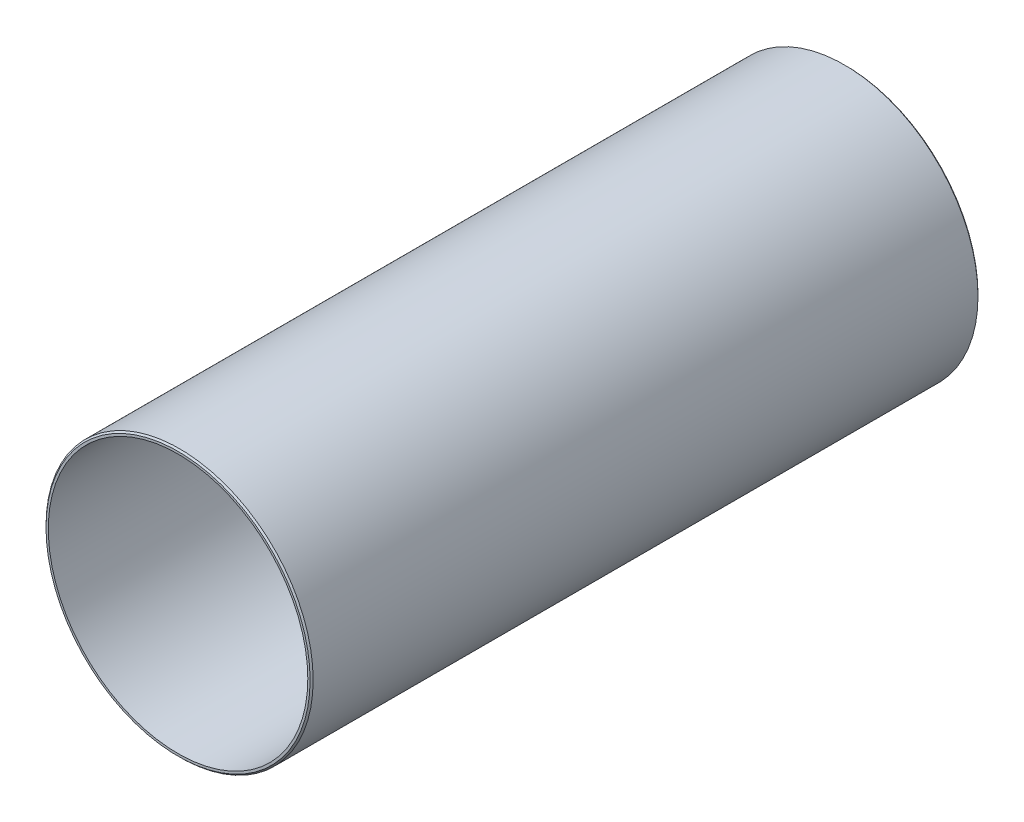
ISO-10303-21;
HEADER;
FILE_DESCRIPTION(('STEP AP214'),'2;1');
FILE_NAME('part.step','',(''),(''),'','','');
FILE_SCHEMA(('AUTOMOTIVE_DESIGN { 1 0 10303 214 1 1 1 1 }'));
ENDSEC;
DATA;
#1=APPLICATION_CONTEXT('core data for automotive mechanical design processes');
#2=APPLICATION_PROTOCOL_DEFINITION('international standard','automotive_design',2000,#1);
#3=PRODUCT_CONTEXT('',#1,'mechanical');
#4=PRODUCT('Part','Part','',(#3));
#5=PRODUCT_RELATED_PRODUCT_CATEGORY('part','',(#4));
#6=PRODUCT_DEFINITION_FORMATION('','',#4);
#7=PRODUCT_DEFINITION_CONTEXT('part definition',#1,'design');
#8=PRODUCT_DEFINITION('design','',#6,#7);
#9=PRODUCT_DEFINITION_SHAPE('','',#8);
#10=(LENGTH_UNIT() NAMED_UNIT(*) SI_UNIT(.MILLI.,.METRE.));
#11=(NAMED_UNIT(*) PLANE_ANGLE_UNIT() SI_UNIT($,.RADIAN.));
#12=(NAMED_UNIT(*) SI_UNIT($,.STERADIAN.) SOLID_ANGLE_UNIT());
#13=UNCERTAINTY_MEASURE_WITH_UNIT(LENGTH_MEASURE(1.E-05),#10,'distance_accuracy_value','');
#14=(GEOMETRIC_REPRESENTATION_CONTEXT(3) GLOBAL_UNCERTAINTY_ASSIGNED_CONTEXT((#13)) GLOBAL_UNIT_ASSIGNED_CONTEXT((#10,
#11,#12)) REPRESENTATION_CONTEXT('',''));
#15=CARTESIAN_POINT('',(0.,0.,0.));
#16=DIRECTION('',(0.,0.,1.));
#17=DIRECTION('',(1.,0.,0.));
#18=AXIS2_PLACEMENT_3D('',#15,#16,#17);
#19=CARTESIAN_POINT('',(0.,0.,-87.5));
#20=DIRECTION('',(0.,0.,1.));
#21=DIRECTION('',(1.,0.,0.));
#22=AXIS2_PLACEMENT_3D('',#19,#20,#21);
#23=CYLINDRICAL_SURFACE('',#22,17.5);
#24=CARTESIAN_POINT('',(0.,0.,-87.3));
#25=DIRECTION('',(0.,0.,1.));
#26=DIRECTION('',(1.,0.,0.));
#27=AXIS2_PLACEMENT_3D('',#24,#25,#26);
#28=CIRCLE('',#27,17.5);
#29=CARTESIAN_POINT('',(17.5,0.,-87.3));
#30=VERTEX_POINT('',#29);
#31=EDGE_CURVE('E45',#30,#30,#28,.T.);
#32=ORIENTED_EDGE('',*,*,#31,.T.);
#33=EDGE_LOOP('',(#32));
#34=FACE_BOUND('',#33,.T.);
#35=CARTESIAN_POINT('',(0.,0.,-0.200000000000006));
#36=DIRECTION('',(0.,0.,1.));
#37=DIRECTION('',(1.,0.,0.));
#38=AXIS2_PLACEMENT_3D('',#35,#36,#37);
#39=CIRCLE('',#38,17.5);
#40=CARTESIAN_POINT('',(17.5,0.,-0.200000000000006));
#41=VERTEX_POINT('',#40);
#42=EDGE_CURVE('E49',#41,#41,#39,.F.);
#43=ORIENTED_EDGE('',*,*,#42,.T.);
#44=EDGE_LOOP('',(#43));
#45=FACE_BOUND('',#44,.T.);
#46=ADVANCED_FACE('F33',(#34,#45),#23,.T.);
#47=CARTESIAN_POINT('',(0.,0.,-87.5));
#48=DIRECTION('',(0.,0.,1.));
#49=DIRECTION('',(1.,0.,0.));
#50=AXIS2_PLACEMENT_3D('',#47,#48,#49);
#51=PLANE('',#50);
#52=CARTESIAN_POINT('',(0.,0.,-87.5));
#53=DIRECTION('',(0.,0.,1.));
#54=DIRECTION('',(1.,0.,0.));
#55=AXIS2_PLACEMENT_3D('',#52,#53,#54);
#56=CIRCLE('',#55,17.3);
#57=CARTESIAN_POINT('',(17.3,0.,-87.5));
#58=VERTEX_POINT('',#57);
#59=EDGE_CURVE('E41',#58,#58,#56,.F.);
#60=ORIENTED_EDGE('',*,*,#59,.T.);
#61=EDGE_LOOP('',(#60));
#62=FACE_BOUND('',#61,.T.);
#63=CARTESIAN_POINT('',(0.,0.,-87.5));
#64=DIRECTION('',(0.,0.,1.));
#65=DIRECTION('',(1.,0.,0.));
#66=AXIS2_PLACEMENT_3D('',#63,#64,#65);
#67=CIRCLE('',#66,17.);
#68=CARTESIAN_POINT('',(17.,0.,-87.5));
#69=VERTEX_POINT('',#68);
#70=EDGE_CURVE('E54',#69,#69,#67,.T.);
#71=ORIENTED_EDGE('',*,*,#70,.T.);
#72=EDGE_LOOP('',(#71));
#73=FACE_BOUND('',#72,.T.);
#74=ADVANCED_FACE('F61',(#62,#73),#51,.F.);
#75=CARTESIAN_POINT('',(0.,0.,0.));
#76=DIRECTION('',(0.,0.,1.));
#77=DIRECTION('',(1.,0.,0.));
#78=AXIS2_PLACEMENT_3D('',#75,#76,#77);
#79=PLANE('',#78);
#80=CARTESIAN_POINT('',(0.,0.,0.));
#81=DIRECTION('',(0.,0.,1.));
#82=DIRECTION('',(1.,0.,0.));
#83=AXIS2_PLACEMENT_3D('',#80,#81,#82);
#84=CIRCLE('',#83,17.3);
#85=CARTESIAN_POINT('',(17.3,0.,0.));
#86=VERTEX_POINT('',#85);
#87=EDGE_CURVE('E10',#86,#86,#84,.T.);
#88=ORIENTED_EDGE('',*,*,#87,.T.);
#89=EDGE_LOOP('',(#88));
#90=FACE_BOUND('',#89,.T.);
#91=CARTESIAN_POINT('',(0.,0.,0.));
#92=DIRECTION('',(0.,0.,1.));
#93=DIRECTION('',(1.,0.,0.));
#94=AXIS2_PLACEMENT_3D('',#91,#92,#93);
#95=CIRCLE('',#94,17.);
#96=CARTESIAN_POINT('',(17.,0.,0.));
#97=VERTEX_POINT('',#96);
#98=EDGE_CURVE('E55',#97,#97,#95,.T.);
#99=ORIENTED_EDGE('',*,*,#98,.F.);
#100=EDGE_LOOP('',(#99));
#101=FACE_BOUND('',#100,.T.);
#102=ADVANCED_FACE('F67',(#90,#101),#79,.T.);
#103=CARTESIAN_POINT('',(0.,0.,-87.5));
#104=DIRECTION('',(0.,0.,1.));
#105=DIRECTION('',(1.,0.,0.));
#106=AXIS2_PLACEMENT_3D('',#103,#104,#105);
#107=CYLINDRICAL_SURFACE('',#106,17.);
#108=ORIENTED_EDGE('',*,*,#70,.F.);
#109=EDGE_LOOP('',(#108));
#110=FACE_BOUND('',#109,.T.);
#111=ORIENTED_EDGE('',*,*,#98,.T.);
#112=EDGE_LOOP('',(#111));
#113=FACE_BOUND('',#112,.T.);
#114=ADVANCED_FACE('F63',(#110,#113),#107,.F.);
#115=CARTESIAN_POINT('',(0.,0.,-87.3));
#116=DIRECTION('',(0.,0.,1.));
#117=DIRECTION('',(1.,0.,0.));
#118=AXIS2_PLACEMENT_3D('',#115,#116,#117);
#119=CONICAL_SURFACE('',#118,17.5,0.785398163397422);
#120=ORIENTED_EDGE('',*,*,#59,.F.);
#121=EDGE_LOOP('',(#120));
#122=FACE_BOUND('',#121,.T.);
#123=ORIENTED_EDGE('',*,*,#31,.F.);
#124=EDGE_LOOP('',(#123));
#125=FACE_BOUND('',#124,.T.);
#126=ADVANCED_FACE('F66',(#122,#125),#119,.T.);
#127=CARTESIAN_POINT('',(0.,0.,0.));
#128=DIRECTION('',(0.,0.,-1.));
#129=DIRECTION('',(-1.,0.,0.));
#130=AXIS2_PLACEMENT_3D('',#127,#128,#129);
#131=CONICAL_SURFACE('',#130,17.3,0.785398163397422);
#132=ORIENTED_EDGE('',*,*,#42,.F.);
#133=EDGE_LOOP('',(#132));
#134=FACE_BOUND('',#133,.T.);
#135=ORIENTED_EDGE('',*,*,#87,.F.);
#136=EDGE_LOOP('',(#135));
#137=FACE_BOUND('',#136,.T.);
#138=ADVANCED_FACE('F36',(#134,#137),#131,.T.);
#139=CLOSED_SHELL('',(#46,#74,#102,#114,#126,#138));
#140=MANIFOLD_SOLID_BREP('B2',#139);
#141=ADVANCED_BREP_SHAPE_REPRESENTATION('',(#18,#140),#14);
#142=SHAPE_DEFINITION_REPRESENTATION(#9,#141);
ENDSEC;
END-ISO-10303-21;
